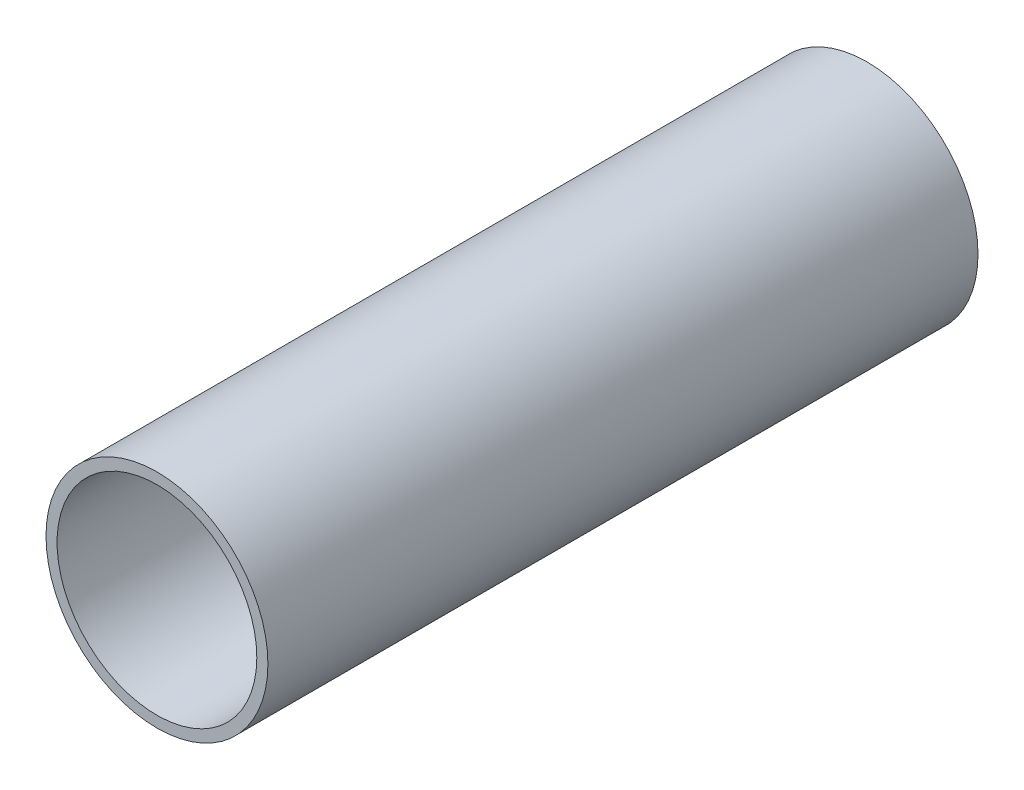
ISO-10303-21;
HEADER;
FILE_DESCRIPTION(('STEP AP214'),'2;1');
FILE_NAME('part.step','',(''),(''),'','','');
FILE_SCHEMA(('AUTOMOTIVE_DESIGN { 1 0 10303 214 1 1 1 1 }'));
ENDSEC;
DATA;
#1=APPLICATION_CONTEXT('core data for automotive mechanical design processes');
#2=APPLICATION_PROTOCOL_DEFINITION('international standard','automotive_design',2000,#1);
#3=PRODUCT_CONTEXT('',#1,'mechanical');
#4=PRODUCT('Part','Part','',(#3));
#5=PRODUCT_RELATED_PRODUCT_CATEGORY('part','',(#4));
#6=PRODUCT_DEFINITION_FORMATION('','',#4);
#7=PRODUCT_DEFINITION_CONTEXT('part definition',#1,'design');
#8=PRODUCT_DEFINITION('design','',#6,#7);
#9=PRODUCT_DEFINITION_SHAPE('','',#8);
#10=(LENGTH_UNIT() NAMED_UNIT(*) SI_UNIT(.MILLI.,.METRE.));
#11=(NAMED_UNIT(*) PLANE_ANGLE_UNIT() SI_UNIT($,.RADIAN.));
#12=(NAMED_UNIT(*) SI_UNIT($,.STERADIAN.) SOLID_ANGLE_UNIT());
#13=UNCERTAINTY_MEASURE_WITH_UNIT(LENGTH_MEASURE(1.E-05),#10,'distance_accuracy_value','');
#14=(GEOMETRIC_REPRESENTATION_CONTEXT(3) GLOBAL_UNCERTAINTY_ASSIGNED_CONTEXT((#13)) GLOBAL_UNIT_ASSIGNED_CONTEXT((#10,
#11,#12)) REPRESENTATION_CONTEXT('',''));
#15=CARTESIAN_POINT('',(0.,0.,0.));
#16=DIRECTION('',(0.,0.,1.));
#17=DIRECTION('',(1.,0.,0.));
#18=AXIS2_PLACEMENT_3D('',#15,#16,#17);
#19=CARTESIAN_POINT('',(0.,0.,64.));
#20=DIRECTION('',(0.,0.,1.));
#21=DIRECTION('',(1.,0.,0.));
#22=AXIS2_PLACEMENT_3D('',#19,#20,#21);
#23=PLANE('',#22);
#24=CARTESIAN_POINT('',(0.,0.,64.));
#25=DIRECTION('',(0.,0.,1.));
#26=DIRECTION('',(1.,0.,0.));
#27=AXIS2_PLACEMENT_3D('',#24,#25,#26);
#28=CIRCLE('',#27,10.);
#29=CARTESIAN_POINT('',(10.,0.,64.));
#30=VERTEX_POINT('',#29);
#31=EDGE_CURVE('E10',#30,#30,#28,.T.);
#32=ORIENTED_EDGE('',*,*,#31,.T.);
#33=EDGE_LOOP('',(#32));
#34=FACE_BOUND('',#33,.T.);
#35=CARTESIAN_POINT('',(0.,0.,64.));
#36=DIRECTION('',(0.,0.,1.));
#37=DIRECTION('',(1.,0.,0.));
#38=AXIS2_PLACEMENT_3D('',#35,#36,#37);
#39=CIRCLE('',#38,9.);
#40=CARTESIAN_POINT('',(9.,0.,64.));
#41=VERTEX_POINT('',#40);
#42=EDGE_CURVE('E50',#41,#41,#39,.T.);
#43=ORIENTED_EDGE('',*,*,#42,.F.);
#44=EDGE_LOOP('',(#43));
#45=FACE_BOUND('',#44,.T.);
#46=ADVANCED_FACE('F39',(#34,#45),#23,.T.);
#47=CARTESIAN_POINT('',(0.,0.,0.));
#48=DIRECTION('',(0.,0.,1.));
#49=DIRECTION('',(1.,0.,0.));
#50=AXIS2_PLACEMENT_3D('',#47,#48,#49);
#51=PLANE('',#50);
#52=CARTESIAN_POINT('',(0.,0.,0.));
#53=DIRECTION('',(0.,0.,1.));
#54=DIRECTION('',(1.,0.,0.));
#55=AXIS2_PLACEMENT_3D('',#52,#53,#54);
#56=CIRCLE('',#55,10.);
#57=CARTESIAN_POINT('',(10.,0.,0.));
#58=VERTEX_POINT('',#57);
#59=EDGE_CURVE('E43',#58,#58,#56,.T.);
#60=ORIENTED_EDGE('',*,*,#59,.F.);
#61=EDGE_LOOP('',(#60));
#62=FACE_BOUND('',#61,.T.);
#63=CARTESIAN_POINT('',(0.,0.,0.));
#64=DIRECTION('',(0.,0.,1.));
#65=DIRECTION('',(1.,0.,0.));
#66=AXIS2_PLACEMENT_3D('',#63,#64,#65);
#67=CIRCLE('',#66,9.);
#68=CARTESIAN_POINT('',(9.,0.,0.));
#69=VERTEX_POINT('',#68);
#70=EDGE_CURVE('E52',#69,#69,#67,.T.);
#71=ORIENTED_EDGE('',*,*,#70,.T.);
#72=EDGE_LOOP('',(#71));
#73=FACE_BOUND('',#72,.T.);
#74=ADVANCED_FACE('F62',(#62,#73),#51,.F.);
#75=CARTESIAN_POINT('',(0.,0.,64.));
#76=DIRECTION('',(0.,0.,-1.));
#77=DIRECTION('',(-1.,0.,0.));
#78=AXIS2_PLACEMENT_3D('',#75,#76,#77);
#79=CYLINDRICAL_SURFACE('',#78,10.);
#80=ORIENTED_EDGE('',*,*,#31,.F.);
#81=EDGE_LOOP('',(#80));
#82=FACE_BOUND('',#81,.T.);
#83=ORIENTED_EDGE('',*,*,#59,.T.);
#84=EDGE_LOOP('',(#83));
#85=FACE_BOUND('',#84,.T.);
#86=ADVANCED_FACE('F41',(#82,#85),#79,.T.);
#87=CARTESIAN_POINT('',(0.,0.,64.));
#88=DIRECTION('',(0.,0.,-1.));
#89=DIRECTION('',(-1.,0.,0.));
#90=AXIS2_PLACEMENT_3D('',#87,#88,#89);
#91=CYLINDRICAL_SURFACE('',#90,9.);
#92=ORIENTED_EDGE('',*,*,#42,.T.);
#93=EDGE_LOOP('',(#92));
#94=FACE_BOUND('',#93,.T.);
#95=ORIENTED_EDGE('',*,*,#70,.F.);
#96=EDGE_LOOP('',(#95));
#97=FACE_BOUND('',#96,.T.);
#98=ADVANCED_FACE('F58',(#94,#97),#91,.F.);
#99=CLOSED_SHELL('',(#46,#74,#86,#98));
#100=MANIFOLD_SOLID_BREP('B2',#99);
#101=ADVANCED_BREP_SHAPE_REPRESENTATION('',(#18,#100),#14);
#102=SHAPE_DEFINITION_REPRESENTATION(#9,#101);
ENDSEC;
END-ISO-10303-21;
